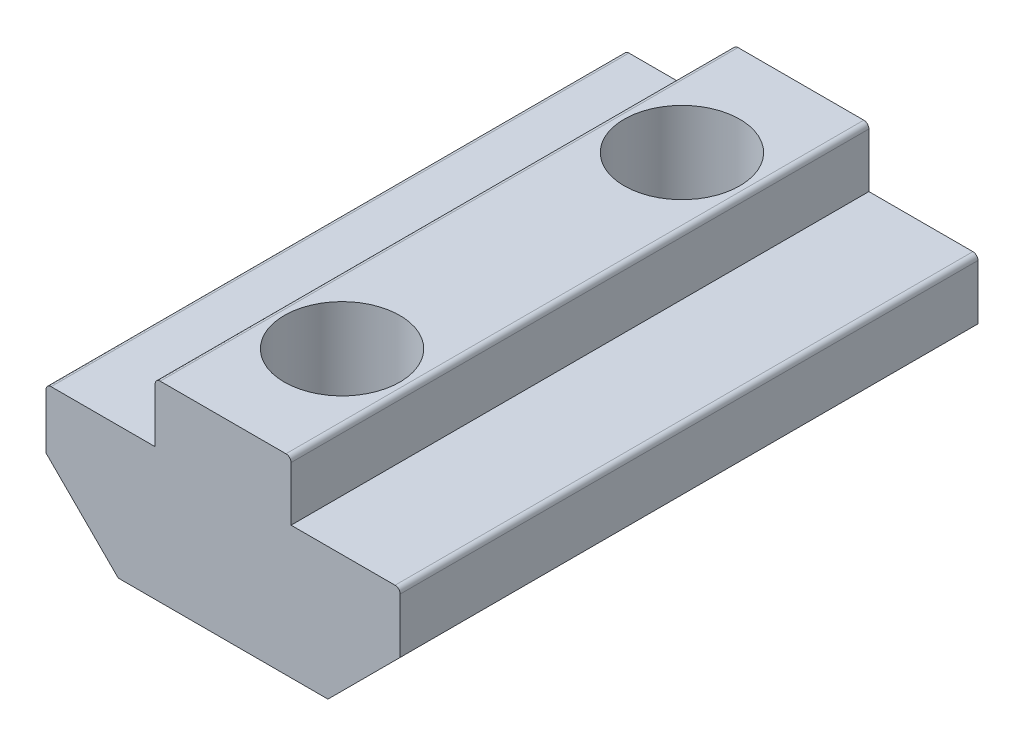
ISO-10303-21;
HEADER;
FILE_DESCRIPTION(('STEP AP214'),'2;1');
FILE_NAME('part.step','',(''),(''),'','','');
FILE_SCHEMA(('AUTOMOTIVE_DESIGN { 1 0 10303 214 1 1 1 1 }'));
ENDSEC;
DATA;
#1=APPLICATION_CONTEXT('core data for automotive mechanical design processes');
#2=APPLICATION_PROTOCOL_DEFINITION('international standard','automotive_design',2000,#1);
#3=PRODUCT_CONTEXT('',#1,'mechanical');
#4=PRODUCT('Part','Part','',(#3));
#5=PRODUCT_RELATED_PRODUCT_CATEGORY('part','',(#4));
#6=PRODUCT_DEFINITION_FORMATION('','',#4);
#7=PRODUCT_DEFINITION_CONTEXT('part definition',#1,'design');
#8=PRODUCT_DEFINITION('design','',#6,#7);
#9=PRODUCT_DEFINITION_SHAPE('','',#8);
#10=(LENGTH_UNIT() NAMED_UNIT(*) SI_UNIT(.MILLI.,.METRE.));
#11=(NAMED_UNIT(*) PLANE_ANGLE_UNIT() SI_UNIT($,.RADIAN.));
#12=(NAMED_UNIT(*) SI_UNIT($,.STERADIAN.) SOLID_ANGLE_UNIT());
#13=UNCERTAINTY_MEASURE_WITH_UNIT(LENGTH_MEASURE(1.E-05),#10,'distance_accuracy_value','');
#14=(GEOMETRIC_REPRESENTATION_CONTEXT(3) GLOBAL_UNCERTAINTY_ASSIGNED_CONTEXT((#13)) GLOBAL_UNIT_ASSIGNED_CONTEXT((#10,
#11,#12)) REPRESENTATION_CONTEXT('',''));
#15=CARTESIAN_POINT('',(0.,0.,0.));
#16=DIRECTION('',(0.,0.,1.));
#17=DIRECTION('',(1.,0.,0.));
#18=AXIS2_PLACEMENT_3D('',#15,#16,#17);
#19=CARTESIAN_POINT('',(-6.35000300143973,-5.18079242636738,34.));
#20=DIRECTION('',(0.70710678118655,0.707106781186545,0.));
#21=DIRECTION('',(-0.707106781186545,0.70710678118655,0.));
#22=AXIS2_PLACEMENT_3D('',#19,#20,#21);
#23=PLANE('',#22);
#24=DIRECTION('',(0.707106781186545,-0.70710678118655,0.));
#25=VECTOR('',#24,1.);
#26=CARTESIAN_POINT('',(-6.35000300143973,-5.18079242636738,0.));
#27=LINE('',#26,#25);
#28=CARTESIAN_POINT('',(-10.6000030014397,-0.930792426367372,0.));
#29=VERTEX_POINT('',#28);
#30=CARTESIAN_POINT('',(-6.35000300143973,-5.18079242636738,0.));
#31=VERTEX_POINT('',#30);
#32=EDGE_CURVE('E175',#29,#31,#27,.T.);
#33=ORIENTED_EDGE('',*,*,#32,.T.);
#34=DIRECTION('',(0.,0.,-1.));
#35=VECTOR('',#34,1.);
#36=CARTESIAN_POINT('',(-6.35000300143973,-5.18079242636738,34.));
#37=LINE('',#36,#35);
#38=CARTESIAN_POINT('',(-6.35000300143973,-5.18079242636738,34.));
#39=VERTEX_POINT('',#38);
#40=EDGE_CURVE('E13',#39,#31,#37,.T.);
#41=ORIENTED_EDGE('',*,*,#40,.F.);
#42=DIRECTION('',(0.707106781186545,-0.70710678118655,0.));
#43=VECTOR('',#42,1.);
#44=CARTESIAN_POINT('',(-6.35000300143973,-5.18079242636738,34.));
#45=LINE('',#44,#43);
#46=CARTESIAN_POINT('',(-10.6000030014397,-0.930792426367372,34.));
#47=VERTEX_POINT('',#46);
#48=EDGE_CURVE('E202',#47,#39,#45,.T.);
#49=ORIENTED_EDGE('',*,*,#48,.F.);
#50=DIRECTION('',(0.,0.,-1.));
#51=VECTOR('',#50,1.);
#52=CARTESIAN_POINT('',(-10.6000030014397,-0.930792426367372,34.));
#53=LINE('',#52,#51);
#54=EDGE_CURVE('E171',#47,#29,#53,.T.);
#55=ORIENTED_EDGE('',*,*,#54,.T.);
#56=EDGE_LOOP('',(#33,#41,#49,#55));
#57=FACE_BOUND('',#56,.T.);
#58=ADVANCED_FACE('F43',(#57),#23,.F.);
#59=CARTESIAN_POINT('',(-6.35000300143973,-5.18079242636738,34.));
#60=DIRECTION('',(0.,1.,0.));
#61=DIRECTION('',(-1.,0.,0.));
#62=AXIS2_PLACEMENT_3D('',#59,#60,#61);
#63=PLANE('',#62);
#64=CARTESIAN_POINT('',(-0.18000300144129,-5.18079242636749,7.));
#65=DIRECTION('',(0.,1.,0.));
#66=DIRECTION('',(0.,0.,1.));
#67=AXIS2_PLACEMENT_3D('',#64,#65,#66);
#68=CIRCLE('',#67,3.4);
#69=CARTESIAN_POINT('',(-0.18000300144129,-5.18079242636749,10.4));
#70=VERTEX_POINT('',#69);
#71=EDGE_CURVE('E392',#70,#70,#68,.T.);
#72=ORIENTED_EDGE('',*,*,#71,.T.);
#73=EDGE_LOOP('',(#72));
#74=FACE_BOUND('',#73,.T.);
#75=CARTESIAN_POINT('',(-0.18000300144129,-5.18079242636749,27.));
#76=DIRECTION('',(0.,1.,0.));
#77=DIRECTION('',(0.,0.,1.));
#78=AXIS2_PLACEMENT_3D('',#75,#76,#77);
#79=CIRCLE('',#78,3.4);
#80=CARTESIAN_POINT('',(-0.18000300144129,-5.18079242636749,30.4));
#81=VERTEX_POINT('',#80);
#82=EDGE_CURVE('E179',#81,#81,#79,.T.);
#83=ORIENTED_EDGE('',*,*,#82,.T.);
#84=EDGE_LOOP('',(#83));
#85=FACE_BOUND('',#84,.T.);
#86=DIRECTION('',(1.,0.,0.));
#87=VECTOR('',#86,1.);
#88=CARTESIAN_POINT('',(-6.35000300143973,-5.18079242636738,0.));
#89=LINE('',#88,#87);
#90=CARTESIAN_POINT('',(5.9899969985604,-5.18079242636749,0.));
#91=VERTEX_POINT('',#90);
#92=EDGE_CURVE('E178',#31,#91,#89,.T.);
#93=ORIENTED_EDGE('',*,*,#92,.T.);
#94=DIRECTION('',(0.,0.,-1.));
#95=VECTOR('',#94,1.);
#96=CARTESIAN_POINT('',(5.9899969985604,-5.18079242636749,34.));
#97=LINE('',#96,#95);
#98=CARTESIAN_POINT('',(5.9899969985604,-5.18079242636749,34.));
#99=VERTEX_POINT('',#98);
#100=EDGE_CURVE('E51',#99,#91,#97,.T.);
#101=ORIENTED_EDGE('',*,*,#100,.F.);
#102=DIRECTION('',(1.,0.,0.));
#103=VECTOR('',#102,1.);
#104=CARTESIAN_POINT('',(-6.35000300143973,-5.18079242636738,34.));
#105=LINE('',#104,#103);
#106=EDGE_CURVE('E120',#39,#99,#105,.T.);
#107=ORIENTED_EDGE('',*,*,#106,.F.);
#108=ORIENTED_EDGE('',*,*,#40,.T.);
#109=EDGE_LOOP('',(#93,#101,#107,#108));
#110=FACE_BOUND('',#109,.T.);
#111=ADVANCED_FACE('F290',(#74,#85,#110),#63,.F.);
#112=CARTESIAN_POINT('',(5.9899969985604,-5.18079242636749,34.));
#113=DIRECTION('',(-0.70710678118655,0.707106781186545,0.));
#114=DIRECTION('',(-0.707106781186545,-0.70710678118655,0.));
#115=AXIS2_PLACEMENT_3D('',#112,#113,#114);
#116=PLANE('',#115);
#117=DIRECTION('',(0.707106781186545,0.70710678118655,0.));
#118=VECTOR('',#117,1.);
#119=CARTESIAN_POINT('',(5.9899969985604,-5.18079242636749,0.));
#120=LINE('',#119,#118);
#121=CARTESIAN_POINT('',(10.2399969985605,-0.930792426367372,0.));
#122=VERTEX_POINT('',#121);
#123=EDGE_CURVE('E181',#91,#122,#120,.T.);
#124=ORIENTED_EDGE('',*,*,#123,.T.);
#125=DIRECTION('',(0.,0.,-1.));
#126=VECTOR('',#125,1.);
#127=CARTESIAN_POINT('',(10.2399969985605,-0.930792426367372,34.));
#128=LINE('',#127,#126);
#129=CARTESIAN_POINT('',(10.2399969985605,-0.930792426367372,34.));
#130=VERTEX_POINT('',#129);
#131=EDGE_CURVE('E227',#130,#122,#128,.T.);
#132=ORIENTED_EDGE('',*,*,#131,.F.);
#133=DIRECTION('',(0.707106781186545,0.70710678118655,0.));
#134=VECTOR('',#133,1.);
#135=CARTESIAN_POINT('',(5.9899969985604,-5.18079242636749,34.));
#136=LINE('',#135,#134);
#137=EDGE_CURVE('E235',#99,#130,#136,.T.);
#138=ORIENTED_EDGE('',*,*,#137,.F.);
#139=ORIENTED_EDGE('',*,*,#100,.T.);
#140=EDGE_LOOP('',(#124,#132,#138,#139));
#141=FACE_BOUND('',#140,.T.);
#142=ADVANCED_FACE('F233',(#141),#116,.F.);
#143=CARTESIAN_POINT('',(10.2399969985605,-0.930792426367372,34.));
#144=DIRECTION('',(-1.,0.,0.));
#145=DIRECTION('',(0.,0.,1.));
#146=AXIS2_PLACEMENT_3D('',#143,#144,#145);
#147=PLANE('',#146);
#148=DIRECTION('',(0.,1.,0.));
#149=VECTOR('',#148,1.);
#150=CARTESIAN_POINT('',(10.2399969985605,-0.930792426367372,0.));
#151=LINE('',#150,#149);
#152=CARTESIAN_POINT('',(10.2399969985605,2.29920757363275,0.));
#153=VERTEX_POINT('',#152);
#154=EDGE_CURVE('E183',#122,#153,#151,.T.);
#155=ORIENTED_EDGE('',*,*,#154,.T.);
#156=DIRECTION('',(0.,0.,-1.));
#157=VECTOR('',#156,1.);
#158=CARTESIAN_POINT('',(10.2399969985605,2.29920757363275,34.));
#159=LINE('',#158,#157);
#160=CARTESIAN_POINT('',(10.2399969985605,2.29920757363275,34.));
#161=VERTEX_POINT('',#160);
#162=EDGE_CURVE('E224',#161,#153,#159,.T.);
#163=ORIENTED_EDGE('',*,*,#162,.F.);
#164=DIRECTION('',(0.,1.,0.));
#165=VECTOR('',#164,1.);
#166=CARTESIAN_POINT('',(10.2399969985605,-0.930792426367372,34.));
#167=LINE('',#166,#165);
#168=EDGE_CURVE('E253',#130,#161,#167,.T.);
#169=ORIENTED_EDGE('',*,*,#168,.F.);
#170=ORIENTED_EDGE('',*,*,#131,.T.);
#171=EDGE_LOOP('',(#155,#163,#169,#170));
#172=FACE_BOUND('',#171,.T.);
#173=ADVANCED_FACE('F244',(#172),#147,.F.);
#174=CARTESIAN_POINT('',(9.93999699855986,2.29920757363275,34.));
#175=DIRECTION('',(0.,0.,-1.));
#176=DIRECTION('',(-1.,0.,0.));
#177=AXIS2_PLACEMENT_3D('',#174,#175,#176);
#178=CYLINDRICAL_SURFACE('',#177,0.300000000000602);
#179=CARTESIAN_POINT('',(9.93999699855986,2.29920757363275,0.));
#180=DIRECTION('',(0.,0.,1.));
#181=DIRECTION('',(1.,0.,0.));
#182=AXIS2_PLACEMENT_3D('',#179,#180,#181);
#183=CIRCLE('',#182,0.300000000000602);
#184=CARTESIAN_POINT('',(9.93999699855986,2.59920757363335,0.));
#185=VERTEX_POINT('',#184);
#186=EDGE_CURVE('E185',#153,#185,#183,.T.);
#187=ORIENTED_EDGE('',*,*,#186,.T.);
#188=DIRECTION('',(0.,0.,-1.));
#189=VECTOR('',#188,1.);
#190=CARTESIAN_POINT('',(9.93999699855986,2.59920757363335,34.));
#191=LINE('',#190,#189);
#192=CARTESIAN_POINT('',(9.93999699855986,2.59920757363335,34.));
#193=VERTEX_POINT('',#192);
#194=EDGE_CURVE('E221',#193,#185,#191,.T.);
#195=ORIENTED_EDGE('',*,*,#194,.F.);
#196=CARTESIAN_POINT('',(9.93999699855986,2.29920757363275,34.));
#197=DIRECTION('',(0.,0.,1.));
#198=DIRECTION('',(1.,0.,0.));
#199=AXIS2_PLACEMENT_3D('',#196,#197,#198);
#200=CIRCLE('',#199,0.300000000000602);
#201=EDGE_CURVE('E250',#161,#193,#200,.T.);
#202=ORIENTED_EDGE('',*,*,#201,.F.);
#203=ORIENTED_EDGE('',*,*,#162,.T.);
#204=EDGE_LOOP('',(#187,#195,#202,#203));
#205=FACE_BOUND('',#204,.T.);
#206=ADVANCED_FACE('F248',(#205),#178,.T.);
#207=CARTESIAN_POINT('',(3.81999699855815,2.59920757363333,34.));
#208=DIRECTION('',(0.,-1.,0.));
#209=DIRECTION('',(0.,0.,-1.));
#210=AXIS2_PLACEMENT_3D('',#207,#208,#209);
#211=PLANE('',#210);
#212=DIRECTION('',(-1.,0.,0.));
#213=VECTOR('',#212,1.);
#214=CARTESIAN_POINT('',(3.81999699855815,2.59920757363333,0.));
#215=LINE('',#214,#213);
#216=CARTESIAN_POINT('',(3.81999699855815,2.59920757363333,0.));
#217=VERTEX_POINT('',#216);
#218=EDGE_CURVE('E187',#185,#217,#215,.T.);
#219=ORIENTED_EDGE('',*,*,#218,.T.);
#220=DIRECTION('',(0.,0.,-1.));
#221=VECTOR('',#220,1.);
#222=CARTESIAN_POINT('',(3.81999699855815,2.59920757363333,34.));
#223=LINE('',#222,#221);
#224=CARTESIAN_POINT('',(3.81999699855815,2.59920757363333,34.));
#225=VERTEX_POINT('',#224);
#226=EDGE_CURVE('E218',#225,#217,#223,.T.);
#227=ORIENTED_EDGE('',*,*,#226,.F.);
#228=DIRECTION('',(-1.,0.,0.));
#229=VECTOR('',#228,1.);
#230=CARTESIAN_POINT('',(3.81999699855815,2.59920757363333,34.));
#231=LINE('',#230,#229);
#232=EDGE_CURVE('E252',#193,#225,#231,.T.);
#233=ORIENTED_EDGE('',*,*,#232,.F.);
#234=ORIENTED_EDGE('',*,*,#194,.T.);
#235=EDGE_LOOP('',(#219,#227,#233,#234));
#236=FACE_BOUND('',#235,.T.);
#237=ADVANCED_FACE('F306',(#236),#211,.F.);
#238=CARTESIAN_POINT('',(3.81999699855815,5.78920757363244,34.));
#239=DIRECTION('',(-1.,0.,0.));
#240=DIRECTION('',(0.,0.,1.));
#241=AXIS2_PLACEMENT_3D('',#238,#239,#240);
#242=PLANE('',#241);
#243=DIRECTION('',(0.,1.,0.));
#244=VECTOR('',#243,1.);
#245=CARTESIAN_POINT('',(3.81999699855815,5.78920757363244,0.));
#246=LINE('',#245,#244);
#247=CARTESIAN_POINT('',(3.81999699855815,5.78920757363244,0.));
#248=VERTEX_POINT('',#247);
#249=EDGE_CURVE('E189',#217,#248,#246,.T.);
#250=ORIENTED_EDGE('',*,*,#249,.T.);
#251=DIRECTION('',(0.,0.,-1.));
#252=VECTOR('',#251,1.);
#253=CARTESIAN_POINT('',(3.81999699855815,5.78920757363244,34.));
#254=LINE('',#253,#252);
#255=CARTESIAN_POINT('',(3.81999699855815,5.78920757363244,34.));
#256=VERTEX_POINT('',#255);
#257=EDGE_CURVE('E215',#256,#248,#254,.T.);
#258=ORIENTED_EDGE('',*,*,#257,.F.);
#259=DIRECTION('',(0.,1.,0.));
#260=VECTOR('',#259,1.);
#261=CARTESIAN_POINT('',(3.81999699855815,5.78920757363244,34.));
#262=LINE('',#261,#260);
#263=EDGE_CURVE('E255',#225,#256,#262,.T.);
#264=ORIENTED_EDGE('',*,*,#263,.F.);
#265=ORIENTED_EDGE('',*,*,#226,.T.);
#266=EDGE_LOOP('',(#250,#258,#264,#265));
#267=FACE_BOUND('',#266,.T.);
#268=ADVANCED_FACE('F309',(#267),#242,.F.);
#269=CARTESIAN_POINT('',(3.51999699855764,5.78920757363244,34.));
#270=DIRECTION('',(0.,0.,-1.));
#271=DIRECTION('',(-1.,0.,0.));
#272=AXIS2_PLACEMENT_3D('',#269,#270,#271);
#273=CYLINDRICAL_SURFACE('',#272,0.300000000000508);
#274=CARTESIAN_POINT('',(3.51999699855764,5.78920757363244,0.));
#275=DIRECTION('',(0.,0.,1.));
#276=DIRECTION('',(1.,0.,0.));
#277=AXIS2_PLACEMENT_3D('',#274,#275,#276);
#278=CIRCLE('',#277,0.300000000000508);
#279=CARTESIAN_POINT('',(3.51999699855764,6.08920757363295,0.));
#280=VERTEX_POINT('',#279);
#281=EDGE_CURVE('E191',#248,#280,#278,.T.);
#282=ORIENTED_EDGE('',*,*,#281,.T.);
#283=DIRECTION('',(0.,0.,-1.));
#284=VECTOR('',#283,1.);
#285=CARTESIAN_POINT('',(3.51999699855764,6.08920757363295,34.));
#286=LINE('',#285,#284);
#287=CARTESIAN_POINT('',(3.51999699855764,6.08920757363295,34.));
#288=VERTEX_POINT('',#287);
#289=EDGE_CURVE('E212',#288,#280,#286,.T.);
#290=ORIENTED_EDGE('',*,*,#289,.F.);
#291=CARTESIAN_POINT('',(3.51999699855764,5.78920757363244,34.));
#292=DIRECTION('',(0.,0.,1.));
#293=DIRECTION('',(1.,0.,0.));
#294=AXIS2_PLACEMENT_3D('',#291,#292,#293);
#295=CIRCLE('',#294,0.300000000000508);
#296=EDGE_CURVE('E261',#256,#288,#295,.T.);
#297=ORIENTED_EDGE('',*,*,#296,.F.);
#298=ORIENTED_EDGE('',*,*,#257,.T.);
#299=EDGE_LOOP('',(#282,#290,#297,#298));
#300=FACE_BOUND('',#299,.T.);
#301=ADVANCED_FACE('F313',(#300),#273,.T.);
#302=CARTESIAN_POINT('',(3.51999699855764,6.08920757363295,34.));
#303=DIRECTION('',(0.,-1.,0.));
#304=DIRECTION('',(0.,0.,-1.));
#305=AXIS2_PLACEMENT_3D('',#302,#303,#304);
#306=PLANE('',#305);
#307=CARTESIAN_POINT('',(-0.18000300144129,6.08920757363295,7.));
#308=DIRECTION('',(0.,1.,0.));
#309=DIRECTION('',(0.,0.,1.));
#310=AXIS2_PLACEMENT_3D('',#307,#308,#309);
#311=CIRCLE('',#310,3.39999999999999);
#312=CARTESIAN_POINT('',(-0.18000300144129,6.08920757363295,10.4));
#313=VERTEX_POINT('',#312);
#314=EDGE_CURVE('E395',#313,#313,#311,.T.);
#315=ORIENTED_EDGE('',*,*,#314,.F.);
#316=EDGE_LOOP('',(#315));
#317=FACE_BOUND('',#316,.T.);
#318=CARTESIAN_POINT('',(-0.18000300144129,6.08920757363295,27.));
#319=DIRECTION('',(0.,1.,0.));
#320=DIRECTION('',(0.,0.,1.));
#321=AXIS2_PLACEMENT_3D('',#318,#319,#320);
#322=CIRCLE('',#321,3.39999999999999);
#323=CARTESIAN_POINT('',(-0.18000300144129,6.08920757363295,30.4));
#324=VERTEX_POINT('',#323);
#325=EDGE_CURVE('E397',#324,#324,#322,.T.);
#326=ORIENTED_EDGE('',*,*,#325,.F.);
#327=EDGE_LOOP('',(#326));
#328=FACE_BOUND('',#327,.T.);
#329=DIRECTION('',(-1.,0.,0.));
#330=VECTOR('',#329,1.);
#331=CARTESIAN_POINT('',(3.51999699855764,6.08920757363295,0.));
#332=LINE('',#331,#330);
#333=CARTESIAN_POINT('',(-3.88000300144022,6.08920757363295,0.));
#334=VERTEX_POINT('',#333);
#335=EDGE_CURVE('E193',#280,#334,#332,.T.);
#336=ORIENTED_EDGE('',*,*,#335,.T.);
#337=DIRECTION('',(0.,0.,-1.));
#338=VECTOR('',#337,1.);
#339=CARTESIAN_POINT('',(-3.88000300144022,6.08920757363295,34.));
#340=LINE('',#339,#338);
#341=CARTESIAN_POINT('',(-3.88000300144022,6.08920757363295,34.));
#342=VERTEX_POINT('',#341);
#343=EDGE_CURVE('E209',#342,#334,#340,.T.);
#344=ORIENTED_EDGE('',*,*,#343,.F.);
#345=DIRECTION('',(-1.,0.,0.));
#346=VECTOR('',#345,1.);
#347=CARTESIAN_POINT('',(3.51999699855764,6.08920757363295,34.));
#348=LINE('',#347,#346);
#349=EDGE_CURVE('E263',#288,#342,#348,.T.);
#350=ORIENTED_EDGE('',*,*,#349,.F.);
#351=ORIENTED_EDGE('',*,*,#289,.T.);
#352=EDGE_LOOP('',(#336,#344,#350,#351));
#353=FACE_BOUND('',#352,.T.);
#354=ADVANCED_FACE('F317',(#317,#328,#353),#306,.F.);
#355=CARTESIAN_POINT('',(-3.88000300144022,5.78920757363299,34.));
#356=DIRECTION('',(0.,0.,-1.));
#357=DIRECTION('',(-1.,0.,0.));
#358=AXIS2_PLACEMENT_3D('',#355,#356,#357);
#359=CYLINDRICAL_SURFACE('',#358,0.299999999999953);
#360=CARTESIAN_POINT('',(-3.88000300144022,5.78920757363299,0.));
#361=DIRECTION('',(0.,0.,1.));
#362=DIRECTION('',(1.,0.,0.));
#363=AXIS2_PLACEMENT_3D('',#360,#361,#362);
#364=CIRCLE('',#363,0.299999999999953);
#365=CARTESIAN_POINT('',(-4.18000300144017,5.78920757363299,0.));
#366=VERTEX_POINT('',#365);
#367=EDGE_CURVE('E195',#334,#366,#364,.T.);
#368=ORIENTED_EDGE('',*,*,#367,.T.);
#369=DIRECTION('',(0.,0.,-1.));
#370=VECTOR('',#369,1.);
#371=CARTESIAN_POINT('',(-4.18000300144017,5.78920757363299,34.));
#372=LINE('',#371,#370);
#373=CARTESIAN_POINT('',(-4.18000300144017,5.78920757363299,34.));
#374=VERTEX_POINT('',#373);
#375=EDGE_CURVE('E206',#374,#366,#372,.T.);
#376=ORIENTED_EDGE('',*,*,#375,.F.);
#377=CARTESIAN_POINT('',(-3.88000300144022,5.78920757363299,34.));
#378=DIRECTION('',(0.,0.,1.));
#379=DIRECTION('',(1.,0.,0.));
#380=AXIS2_PLACEMENT_3D('',#377,#378,#379);
#381=CIRCLE('',#380,0.299999999999953);
#382=EDGE_CURVE('E265',#342,#374,#381,.T.);
#383=ORIENTED_EDGE('',*,*,#382,.F.);
#384=ORIENTED_EDGE('',*,*,#343,.T.);
#385=EDGE_LOOP('',(#368,#376,#383,#384));
#386=FACE_BOUND('',#385,.T.);
#387=ADVANCED_FACE('F271',(#386),#359,.T.);
#388=CARTESIAN_POINT('',(-4.18000300144017,5.78920757363299,34.));
#389=DIRECTION('',(1.,0.,0.));
#390=DIRECTION('',(0.,0.,-1.));
#391=AXIS2_PLACEMENT_3D('',#388,#389,#390);
#392=PLANE('',#391);
#393=DIRECTION('',(0.,-1.,0.));
#394=VECTOR('',#393,1.);
#395=CARTESIAN_POINT('',(-4.18000300144017,5.78920757363299,0.));
#396=LINE('',#395,#394);
#397=CARTESIAN_POINT('',(-4.18000300144017,2.59920757363316,0.));
#398=VERTEX_POINT('',#397);
#399=EDGE_CURVE('E197',#366,#398,#396,.T.);
#400=ORIENTED_EDGE('',*,*,#399,.T.);
#401=DIRECTION('',(0.,0.,-1.));
#402=VECTOR('',#401,1.);
#403=CARTESIAN_POINT('',(-4.18000300144017,2.59920757363316,34.));
#404=LINE('',#403,#402);
#405=CARTESIAN_POINT('',(-4.18000300144017,2.59920757363316,34.));
#406=VERTEX_POINT('',#405);
#407=EDGE_CURVE('E166',#406,#398,#404,.T.);
#408=ORIENTED_EDGE('',*,*,#407,.F.);
#409=DIRECTION('',(0.,-1.,0.));
#410=VECTOR('',#409,1.);
#411=CARTESIAN_POINT('',(-4.18000300144017,5.78920757363299,34.));
#412=LINE('',#411,#410);
#413=EDGE_CURVE('E157',#374,#406,#412,.T.);
#414=ORIENTED_EDGE('',*,*,#413,.F.);
#415=ORIENTED_EDGE('',*,*,#375,.T.);
#416=EDGE_LOOP('',(#400,#408,#414,#415));
#417=FACE_BOUND('',#416,.T.);
#418=ADVANCED_FACE('F275',(#417),#392,.F.);
#419=CARTESIAN_POINT('',(-10.3000030014392,2.59920757363316,34.));
#420=DIRECTION('',(0.,-1.,0.));
#421=DIRECTION('',(0.,0.,-1.));
#422=AXIS2_PLACEMENT_3D('',#419,#420,#421);
#423=PLANE('',#422);
#424=DIRECTION('',(-1.,0.,0.));
#425=VECTOR('',#424,1.);
#426=CARTESIAN_POINT('',(-10.3000030014392,2.59920757363316,0.));
#427=LINE('',#426,#425);
#428=CARTESIAN_POINT('',(-10.3000030014392,2.59920757363316,0.));
#429=VERTEX_POINT('',#428);
#430=EDGE_CURVE('E165',#398,#429,#427,.T.);
#431=ORIENTED_EDGE('',*,*,#430,.T.);
#432=DIRECTION('',(0.,0.,-1.));
#433=VECTOR('',#432,1.);
#434=CARTESIAN_POINT('',(-10.3000030014392,2.59920757363316,34.));
#435=LINE('',#434,#433);
#436=CARTESIAN_POINT('',(-10.3000030014392,2.59920757363316,34.));
#437=VERTEX_POINT('',#436);
#438=EDGE_CURVE('E162',#437,#429,#435,.T.);
#439=ORIENTED_EDGE('',*,*,#438,.F.);
#440=DIRECTION('',(-1.,0.,0.));
#441=VECTOR('',#440,1.);
#442=CARTESIAN_POINT('',(-10.3000030014392,2.59920757363316,34.));
#443=LINE('',#442,#441);
#444=EDGE_CURVE('E151',#406,#437,#443,.T.);
#445=ORIENTED_EDGE('',*,*,#444,.F.);
#446=ORIENTED_EDGE('',*,*,#407,.T.);
#447=EDGE_LOOP('',(#431,#439,#445,#446));
#448=FACE_BOUND('',#447,.T.);
#449=ADVANCED_FACE('F163',(#448),#423,.F.);
#450=CARTESIAN_POINT('',(-10.3000030014392,2.29920757363264,34.));
#451=DIRECTION('',(0.,0.,-1.));
#452=DIRECTION('',(-1.,0.,0.));
#453=AXIS2_PLACEMENT_3D('',#450,#451,#452);
#454=CYLINDRICAL_SURFACE('',#453,0.300000000000522);
#455=CARTESIAN_POINT('',(-10.3000030014392,2.29920757363264,0.));
#456=DIRECTION('',(0.,0.,1.));
#457=DIRECTION('',(1.,0.,0.));
#458=AXIS2_PLACEMENT_3D('',#455,#456,#457);
#459=CIRCLE('',#458,0.300000000000522);
#460=CARTESIAN_POINT('',(-10.6000030014397,2.29920757363264,0.));
#461=VERTEX_POINT('',#460);
#462=EDGE_CURVE('E106',#429,#461,#459,.T.);
#463=ORIENTED_EDGE('',*,*,#462,.T.);
#464=DIRECTION('',(0.,0.,-1.));
#465=VECTOR('',#464,1.);
#466=CARTESIAN_POINT('',(-10.6000030014397,2.29920757363264,34.));
#467=LINE('',#466,#465);
#468=CARTESIAN_POINT('',(-10.6000030014397,2.29920757363264,34.));
#469=VERTEX_POINT('',#468);
#470=EDGE_CURVE('E167',#469,#461,#467,.T.);
#471=ORIENTED_EDGE('',*,*,#470,.F.);
#472=CARTESIAN_POINT('',(-10.3000030014392,2.29920757363264,34.));
#473=DIRECTION('',(0.,0.,1.));
#474=DIRECTION('',(1.,0.,0.));
#475=AXIS2_PLACEMENT_3D('',#472,#473,#474);
#476=CIRCLE('',#475,0.300000000000522);
#477=EDGE_CURVE('E155',#437,#469,#476,.T.);
#478=ORIENTED_EDGE('',*,*,#477,.F.);
#479=ORIENTED_EDGE('',*,*,#438,.T.);
#480=EDGE_LOOP('',(#463,#471,#478,#479));
#481=FACE_BOUND('',#480,.T.);
#482=ADVANCED_FACE('F169',(#481),#454,.T.);
#483=CARTESIAN_POINT('',(-10.6000030014397,2.29920757363264,34.));
#484=DIRECTION('',(1.,0.,0.));
#485=DIRECTION('',(0.,0.,-1.));
#486=AXIS2_PLACEMENT_3D('',#483,#484,#485);
#487=PLANE('',#486);
#488=DIRECTION('',(0.,-1.,0.));
#489=VECTOR('',#488,1.);
#490=CARTESIAN_POINT('',(-10.6000030014397,2.29920757363264,0.));
#491=LINE('',#490,#489);
#492=EDGE_CURVE('E112',#461,#29,#491,.T.);
#493=ORIENTED_EDGE('',*,*,#492,.T.);
#494=ORIENTED_EDGE('',*,*,#54,.F.);
#495=DIRECTION('',(0.,-1.,0.));
#496=VECTOR('',#495,1.);
#497=CARTESIAN_POINT('',(-10.6000030014397,2.29920757363264,34.));
#498=LINE('',#497,#496);
#499=EDGE_CURVE('E59',#469,#47,#498,.T.);
#500=ORIENTED_EDGE('',*,*,#499,.F.);
#501=ORIENTED_EDGE('',*,*,#470,.T.);
#502=EDGE_LOOP('',(#493,#494,#500,#501));
#503=FACE_BOUND('',#502,.T.);
#504=ADVANCED_FACE('F279',(#503),#487,.F.);
#505=CARTESIAN_POINT('',(-10.3000030014392,2.29920757363264,34.));
#506=DIRECTION('',(0.,0.,1.));
#507=DIRECTION('',(1.,0.,0.));
#508=AXIS2_PLACEMENT_3D('',#505,#506,#507);
#509=PLANE('',#508);
#510=ORIENTED_EDGE('',*,*,#48,.T.);
#511=ORIENTED_EDGE('',*,*,#106,.T.);
#512=ORIENTED_EDGE('',*,*,#137,.T.);
#513=ORIENTED_EDGE('',*,*,#168,.T.);
#514=ORIENTED_EDGE('',*,*,#201,.T.);
#515=ORIENTED_EDGE('',*,*,#232,.T.);
#516=ORIENTED_EDGE('',*,*,#263,.T.);
#517=ORIENTED_EDGE('',*,*,#296,.T.);
#518=ORIENTED_EDGE('',*,*,#349,.T.);
#519=ORIENTED_EDGE('',*,*,#382,.T.);
#520=ORIENTED_EDGE('',*,*,#413,.T.);
#521=ORIENTED_EDGE('',*,*,#444,.T.);
#522=ORIENTED_EDGE('',*,*,#477,.T.);
#523=ORIENTED_EDGE('',*,*,#499,.T.);
#524=EDGE_LOOP('',(#510,#511,#512,#513,#514,#515,#516,#517,#518,#519,#520,#521,#522,#523));
#525=FACE_BOUND('',#524,.T.);
#526=ADVANCED_FACE('F153',(#525),#509,.T.);
#527=CARTESIAN_POINT('',(-10.3000030014392,2.29920757363264,0.));
#528=DIRECTION('',(0.,0.,1.));
#529=DIRECTION('',(1.,0.,0.));
#530=AXIS2_PLACEMENT_3D('',#527,#528,#529);
#531=PLANE('',#530);
#532=ORIENTED_EDGE('',*,*,#32,.F.);
#533=ORIENTED_EDGE('',*,*,#492,.F.);
#534=ORIENTED_EDGE('',*,*,#462,.F.);
#535=ORIENTED_EDGE('',*,*,#430,.F.);
#536=ORIENTED_EDGE('',*,*,#399,.F.);
#537=ORIENTED_EDGE('',*,*,#367,.F.);
#538=ORIENTED_EDGE('',*,*,#335,.F.);
#539=ORIENTED_EDGE('',*,*,#281,.F.);
#540=ORIENTED_EDGE('',*,*,#249,.F.);
#541=ORIENTED_EDGE('',*,*,#218,.F.);
#542=ORIENTED_EDGE('',*,*,#186,.F.);
#543=ORIENTED_EDGE('',*,*,#154,.F.);
#544=ORIENTED_EDGE('',*,*,#123,.F.);
#545=ORIENTED_EDGE('',*,*,#92,.F.);
#546=EDGE_LOOP('',(#532,#533,#534,#535,#536,#537,#538,#539,#540,#541,#542,#543,#544,#545));
#547=FACE_BOUND('',#546,.T.);
#548=ADVANCED_FACE('F239',(#547),#531,.F.);
#549=CARTESIAN_POINT('',(-0.18000300144129,6.08920757363295,27.));
#550=DIRECTION('',(0.,1.,0.));
#551=DIRECTION('',(0.,0.,1.));
#552=AXIS2_PLACEMENT_3D('',#549,#550,#551);
#553=CYLINDRICAL_SURFACE('',#552,3.39999999999999);
#554=ORIENTED_EDGE('',*,*,#82,.F.);
#555=EDGE_LOOP('',(#554));
#556=FACE_BOUND('',#555,.T.);
#557=ORIENTED_EDGE('',*,*,#325,.T.);
#558=EDGE_LOOP('',(#557));
#559=FACE_BOUND('',#558,.T.);
#560=ADVANCED_FACE('F353',(#556,#559),#553,.F.);
#561=CARTESIAN_POINT('',(-0.18000300144129,6.08920757363295,7.));
#562=DIRECTION('',(0.,1.,0.));
#563=DIRECTION('',(0.,0.,1.));
#564=AXIS2_PLACEMENT_3D('',#561,#562,#563);
#565=CYLINDRICAL_SURFACE('',#564,3.39999999999999);
#566=ORIENTED_EDGE('',*,*,#71,.F.);
#567=EDGE_LOOP('',(#566));
#568=FACE_BOUND('',#567,.T.);
#569=ORIENTED_EDGE('',*,*,#314,.T.);
#570=EDGE_LOOP('',(#569));
#571=FACE_BOUND('',#570,.T.);
#572=ADVANCED_FACE('F376',(#568,#571),#565,.F.);
#573=CLOSED_SHELL('',(#58,#111,#142,#173,#206,#237,#268,#301,#354,#387,#418,#449,#482,#504,#526,
#548,#560,#572));
#574=MANIFOLD_SOLID_BREP('B2',#573);
#575=ADVANCED_BREP_SHAPE_REPRESENTATION('',(#18,#574),#14);
#576=SHAPE_DEFINITION_REPRESENTATION(#9,#575);
ENDSEC;
END-ISO-10303-21;
